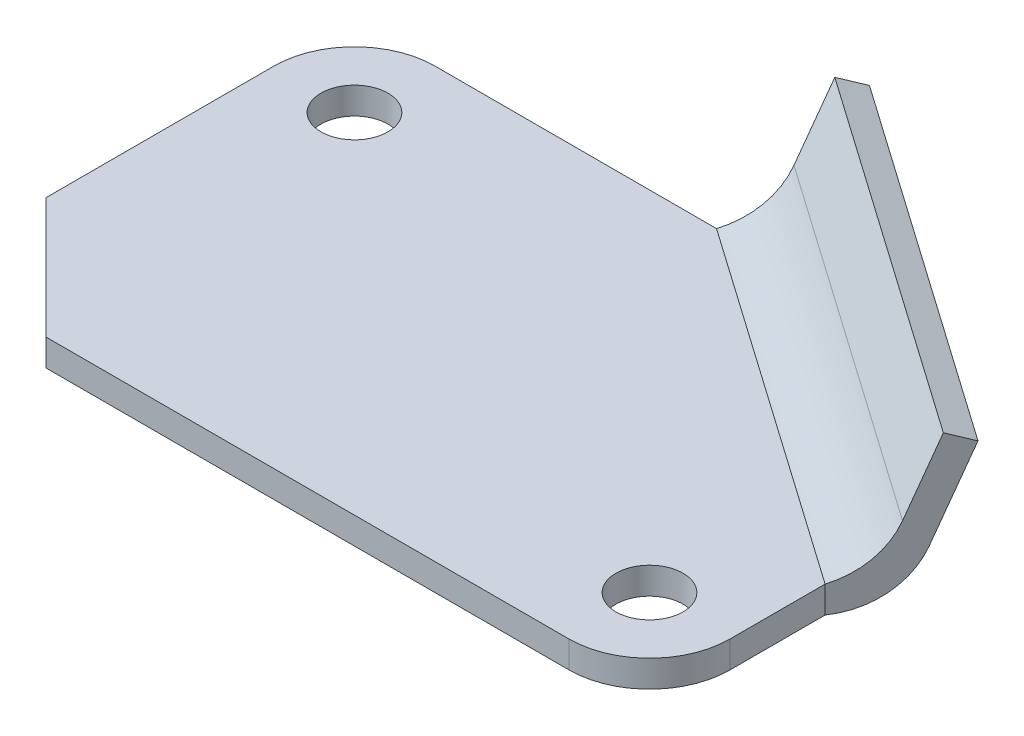
ISO-10303-21;
HEADER;
FILE_DESCRIPTION(('STEP AP214'),'2;1');
FILE_NAME('part.step','',(''),(''),'','','');
FILE_SCHEMA(('AUTOMOTIVE_DESIGN { 1 0 10303 214 1 1 1 1 }'));
ENDSEC;
DATA;
#1=APPLICATION_CONTEXT('core data for automotive mechanical design processes');
#2=APPLICATION_PROTOCOL_DEFINITION('international standard','automotive_design',2000,#1);
#3=PRODUCT_CONTEXT('',#1,'mechanical');
#4=PRODUCT('Part','Part','',(#3));
#5=PRODUCT_RELATED_PRODUCT_CATEGORY('part','',(#4));
#6=PRODUCT_DEFINITION_FORMATION('','',#4);
#7=PRODUCT_DEFINITION_CONTEXT('part definition',#1,'design');
#8=PRODUCT_DEFINITION('design','',#6,#7);
#9=PRODUCT_DEFINITION_SHAPE('','',#8);
#10=(LENGTH_UNIT() NAMED_UNIT(*) SI_UNIT(.MILLI.,.METRE.));
#11=(NAMED_UNIT(*) PLANE_ANGLE_UNIT() SI_UNIT($,.RADIAN.));
#12=(NAMED_UNIT(*) SI_UNIT($,.STERADIAN.) SOLID_ANGLE_UNIT());
#13=UNCERTAINTY_MEASURE_WITH_UNIT(LENGTH_MEASURE(1.E-05),#10,'distance_accuracy_value','');
#14=(GEOMETRIC_REPRESENTATION_CONTEXT(3) GLOBAL_UNCERTAINTY_ASSIGNED_CONTEXT((#13)) GLOBAL_UNIT_ASSIGNED_CONTEXT((#10,
#11,#12)) REPRESENTATION_CONTEXT('',''));
#15=CARTESIAN_POINT('',(0.,0.,0.));
#16=DIRECTION('',(0.,0.,1.));
#17=DIRECTION('',(1.,0.,0.));
#18=AXIS2_PLACEMENT_3D('',#15,#16,#17);
#19=CARTESIAN_POINT('',(-1.62626645259759,15.6602325308119,-29.6774508072912));
#20=DIRECTION('',(0.819152044288995,0.,0.573576436351041));
#21=DIRECTION('',(0.573576436351041,0.,-0.819152044288995));
#22=AXIS2_PLACEMENT_3D('',#19,#20,#21);
#23=CYLINDRICAL_SURFACE('',#22,12.);
#24=CARTESIAN_POINT('',(52.3737335474024,15.6602325308119,8.13375625603269));
#25=DIRECTION('',(-0.819152044288995,0.,-0.573576436351041));
#26=DIRECTION('',(0.573576436351041,0.,-0.819152044288995));
#27=AXIS2_PLACEMENT_3D('',#24,#25,#26);
#28=CIRCLE('',#27,12.);
#29=CARTESIAN_POINT('',(58.7554632811381,11.164953409821,-0.980298342768932));
#30=VERTEX_POINT('',#29);
#31=CARTESIAN_POINT('',(54.,4.,5.81120706332387));
#32=VERTEX_POINT('',#31);
#33=EDGE_CURVE('E134',#30,#32,#28,.T.);
#34=ORIENTED_EDGE('',*,*,#33,.F.);
#35=DIRECTION('',(0.819152044288995,0.,0.573576436351041));
#36=VECTOR('',#35,1.);
#37=CARTESIAN_POINT('',(4.7554632811381,11.164953409821,-38.7915054060928));
#38=LINE('',#37,#36);
#39=CARTESIAN_POINT('',(4.7554632811381,11.164953409821,-38.7915054060928));
#40=VERTEX_POINT('',#39);
#41=EDGE_CURVE('E12',#40,#30,#38,.T.);
#42=ORIENTED_EDGE('',*,*,#41,.F.);
#43=CARTESIAN_POINT('',(-1.62626645259759,15.6602325308119,-29.6774508072912));
#44=DIRECTION('',(-0.819152044288995,0.,-0.573576436351041));
#45=DIRECTION('',(0.573576436351041,0.,-0.819152044288995));
#46=AXIS2_PLACEMENT_3D('',#43,#44,#45);
#47=CIRCLE('',#46,12.);
#48=CARTESIAN_POINT('',(0.,4.,-32.));
#49=VERTEX_POINT('',#48);
#50=EDGE_CURVE('E148',#40,#49,#47,.T.);
#51=ORIENTED_EDGE('',*,*,#50,.T.);
#52=DIRECTION('',(0.819152044288995,0.,0.573576436351041));
#53=VECTOR('',#52,1.);
#54=CARTESIAN_POINT('',(0.,4.,-32.));
#55=LINE('',#54,#53);
#56=EDGE_CURVE('E52',#49,#32,#55,.T.);
#57=ORIENTED_EDGE('',*,*,#56,.T.);
#58=EDGE_LOOP('',(#34,#42,#51,#57));
#59=FACE_BOUND('',#58,.T.);
#60=ADVANCED_FACE('F49',(#59),#23,.F.);
#61=CARTESIAN_POINT('',(4.7554632811381,11.164953409821,-38.7915054060928));
#62=DIRECTION('',(-0.531810811144641,0.374606593415909,0.759504549900135));
#63=DIRECTION('',(0.819152044288995,0.,0.573576436351041));
#64=AXIS2_PLACEMENT_3D('',#61,#62,#63);
#65=PLANE('',#64);
#66=DIRECTION('',(-0.214865514885101,-0.927183854566788,0.306859756800778));
#67=VECTOR('',#66,1.);
#68=CARTESIAN_POINT('',(58.7554632811381,11.164953409821,-0.980298342768932));
#69=LINE('',#68,#67);
#70=CARTESIAN_POINT('',(61.2626036975485,21.9837212166078,-4.56086593108812));
#71=VERTEX_POINT('',#70);
#72=EDGE_CURVE('E146',#71,#30,#69,.T.);
#73=ORIENTED_EDGE('',*,*,#72,.F.);
#74=DIRECTION('',(0.819152044288995,0.,0.573576436351041));
#75=VECTOR('',#74,1.);
#76=CARTESIAN_POINT('',(7.26260369754853,21.9837212166078,-42.372072994412));
#77=LINE('',#76,#75);
#78=CARTESIAN_POINT('',(7.26260369754853,21.9837212166078,-42.372072994412));
#79=VERTEX_POINT('',#78);
#80=EDGE_CURVE('E58',#79,#71,#77,.T.);
#81=ORIENTED_EDGE('',*,*,#80,.F.);
#82=DIRECTION('',(-0.214865514885101,-0.927183854566788,0.306859756800778));
#83=VECTOR('',#82,1.);
#84=CARTESIAN_POINT('',(4.7554632811381,11.164953409821,-38.7915054060928));
#85=LINE('',#84,#83);
#86=EDGE_CURVE('E124',#79,#40,#85,.T.);
#87=ORIENTED_EDGE('',*,*,#86,.T.);
#88=ORIENTED_EDGE('',*,*,#41,.T.);
#89=EDGE_LOOP('',(#73,#81,#87,#88));
#90=FACE_BOUND('',#89,.T.);
#91=ADVANCED_FACE('F156',(#90),#65,.T.);
#92=CARTESIAN_POINT('',(7.26260369754853,21.9837212166078,-42.372072994412));
#93=DIRECTION('',(0.214865514885101,0.927183854566788,-0.306859756800779));
#94=DIRECTION('',(0.,0.314198283252714,0.949357382022728));
#95=AXIS2_PLACEMENT_3D('',#92,#93,#94);
#96=PLANE('',#95);
#97=DIRECTION('',(-0.531810811144642,0.37460659341591,0.759504549900134));
#98=VECTOR('',#97,1.);
#99=CARTESIAN_POINT('',(61.2626036975485,21.9837212166078,-4.56086593108812));
#100=LINE('',#99,#98);
#101=CARTESIAN_POINT('',(63.3898469421271,20.4852948429441,-7.59888413068865));
#102=VERTEX_POINT('',#101);
#103=EDGE_CURVE('E111',#102,#71,#100,.T.);
#104=ORIENTED_EDGE('',*,*,#103,.F.);
#105=DIRECTION('',(0.819152044288995,0.,0.573576436351041));
#106=VECTOR('',#105,1.);
#107=CARTESIAN_POINT('',(9.38984694212709,20.4852948429441,-45.4100911940125));
#108=LINE('',#107,#106);
#109=CARTESIAN_POINT('',(9.38984694212709,20.4852948429441,-45.4100911940125));
#110=VERTEX_POINT('',#109);
#111=EDGE_CURVE('E106',#110,#102,#108,.T.);
#112=ORIENTED_EDGE('',*,*,#111,.F.);
#113=DIRECTION('',(-0.531810811144642,0.37460659341591,0.759504549900134));
#114=VECTOR('',#113,1.);
#115=CARTESIAN_POINT('',(7.26260369754853,21.9837212166078,-42.372072994412));
#116=LINE('',#115,#114);
#117=EDGE_CURVE('E109',#110,#79,#116,.T.);
#118=ORIENTED_EDGE('',*,*,#117,.T.);
#119=ORIENTED_EDGE('',*,*,#80,.T.);
#120=EDGE_LOOP('',(#104,#112,#118,#119));
#121=FACE_BOUND('',#120,.T.);
#122=ADVANCED_FACE('F108',(#121),#96,.T.);
#123=CARTESIAN_POINT('',(9.38984694212709,20.4852948429441,-45.4100911940125));
#124=DIRECTION('',(0.531810811144641,-0.374606593415909,-0.759504549900135));
#125=DIRECTION('',(-0.819152044288995,0.,-0.573576436351041));
#126=AXIS2_PLACEMENT_3D('',#123,#124,#125);
#127=PLANE('',#126);
#128=DIRECTION('',(0.214865514885101,0.927183854566789,-0.306859756800778));
#129=VECTOR('',#128,1.);
#130=CARTESIAN_POINT('',(63.3898469421271,20.4852948429441,-7.59888413068865));
#131=LINE('',#130,#129);
#132=CARTESIAN_POINT('',(60.3817297337357,7.50472087900909,-3.30284753547775));
#133=VERTEX_POINT('',#132);
#134=EDGE_CURVE('E143',#133,#102,#131,.T.);
#135=ORIENTED_EDGE('',*,*,#134,.F.);
#136=DIRECTION('',(0.819152044288995,0.,0.573576436351041));
#137=VECTOR('',#136,1.);
#138=CARTESIAN_POINT('',(6.38172973373567,7.50472087900909,-41.1140545988016));
#139=LINE('',#138,#137);
#140=CARTESIAN_POINT('',(6.38172973373567,7.50472087900909,-41.1140545988016));
#141=VERTEX_POINT('',#140);
#142=EDGE_CURVE('E116',#141,#133,#139,.T.);
#143=ORIENTED_EDGE('',*,*,#142,.F.);
#144=DIRECTION('',(0.214865514885101,0.927183854566789,-0.306859756800778));
#145=VECTOR('',#144,1.);
#146=CARTESIAN_POINT('',(9.38984694212709,20.4852948429441,-45.4100911940125));
#147=LINE('',#146,#145);
#148=EDGE_CURVE('E122',#141,#110,#147,.T.);
#149=ORIENTED_EDGE('',*,*,#148,.T.);
#150=ORIENTED_EDGE('',*,*,#111,.T.);
#151=EDGE_LOOP('',(#135,#143,#149,#150));
#152=FACE_BOUND('',#151,.T.);
#153=ADVANCED_FACE('F126',(#152),#127,.T.);
#154=CARTESIAN_POINT('',(0.,12.,-32.));
#155=DIRECTION('',(0.819152044288995,0.,0.573576436351041));
#156=DIRECTION('',(0.573576436351041,0.,-0.819152044288995));
#157=AXIS2_PLACEMENT_3D('',#154,#155,#156);
#158=CYLINDRICAL_SURFACE('',#157,12.);
#159=CARTESIAN_POINT('',(54.,12.,5.81120706332387));
#160=DIRECTION('',(0.819152044288995,0.,0.573576436351041));
#161=DIRECTION('',(-0.573576436351041,0.,0.819152044288995));
#162=AXIS2_PLACEMENT_3D('',#159,#160,#161);
#163=CIRCLE('',#162,12.);
#164=CARTESIAN_POINT('',(54.,0.,5.81120706332387));
#165=VERTEX_POINT('',#164);
#166=EDGE_CURVE('E140',#165,#133,#163,.T.);
#167=ORIENTED_EDGE('',*,*,#166,.F.);
#168=DIRECTION('',(0.819152044288995,0.,0.573576436351041));
#169=VECTOR('',#168,1.);
#170=CARTESIAN_POINT('',(0.,0.,-32.));
#171=LINE('',#170,#169);
#172=CARTESIAN_POINT('',(0.,0.,-32.));
#173=VERTEX_POINT('',#172);
#174=EDGE_CURVE('E151',#173,#165,#171,.T.);
#175=ORIENTED_EDGE('',*,*,#174,.F.);
#176=CARTESIAN_POINT('',(0.,12.,-32.));
#177=DIRECTION('',(0.819152044288995,0.,0.573576436351041));
#178=DIRECTION('',(-0.573576436351041,0.,0.819152044288995));
#179=AXIS2_PLACEMENT_3D('',#176,#177,#178);
#180=CIRCLE('',#179,12.);
#181=EDGE_CURVE('E127',#173,#141,#180,.T.);
#182=ORIENTED_EDGE('',*,*,#181,.T.);
#183=ORIENTED_EDGE('',*,*,#142,.T.);
#184=EDGE_LOOP('',(#167,#175,#182,#183));
#185=FACE_BOUND('',#184,.T.);
#186=ADVANCED_FACE('F169',(#185),#158,.T.);
#187=CARTESIAN_POINT('',(0.,4.,-32.));
#188=DIRECTION('',(-0.573576436351041,0.,0.819152044288995));
#189=DIRECTION('',(0.819152044288995,0.,0.573576436351041));
#190=AXIS2_PLACEMENT_3D('',#187,#188,#189);
#191=PLANE('',#190);
#192=DIRECTION('',(0.,-1.,0.));
#193=VECTOR('',#192,1.);
#194=CARTESIAN_POINT('',(54.,4.,5.81120706332387));
#195=LINE('',#194,#193);
#196=EDGE_CURVE('E137',#32,#165,#195,.T.);
#197=ORIENTED_EDGE('',*,*,#196,.F.);
#198=ORIENTED_EDGE('',*,*,#56,.F.);
#199=DIRECTION('',(0.,-1.,0.));
#200=VECTOR('',#199,1.);
#201=CARTESIAN_POINT('',(0.,4.,-32.));
#202=LINE('',#201,#200);
#203=EDGE_CURVE('E129',#49,#173,#202,.T.);
#204=ORIENTED_EDGE('',*,*,#203,.T.);
#205=ORIENTED_EDGE('',*,*,#174,.T.);
#206=EDGE_LOOP('',(#197,#198,#204,#205));
#207=FACE_BOUND('',#206,.T.);
#208=ADVANCED_FACE('F153',(#207),#191,.T.);
#209=CARTESIAN_POINT('',(-1.62626645259759,15.6602325308119,-29.6774508072912));
#210=DIRECTION('',(0.819152044288995,0.,0.573576436351041));
#211=DIRECTION('',(0.573576436351041,0.,-0.819152044288995));
#212=AXIS2_PLACEMENT_3D('',#209,#210,#211);
#213=PLANE('',#212);
#214=ORIENTED_EDGE('',*,*,#50,.F.);
#215=ORIENTED_EDGE('',*,*,#86,.F.);
#216=ORIENTED_EDGE('',*,*,#117,.F.);
#217=ORIENTED_EDGE('',*,*,#148,.F.);
#218=ORIENTED_EDGE('',*,*,#181,.F.);
#219=ORIENTED_EDGE('',*,*,#203,.F.);
#220=EDGE_LOOP('',(#214,#215,#216,#217,#218,#219));
#221=FACE_BOUND('',#220,.T.);
#222=ADVANCED_FACE('F120',(#221),#213,.F.);
#223=CARTESIAN_POINT('',(52.3737335474024,15.6602325308119,8.13375625603269));
#224=DIRECTION('',(0.819152044288995,0.,0.573576436351041));
#225=DIRECTION('',(0.573576436351041,0.,-0.819152044288995));
#226=AXIS2_PLACEMENT_3D('',#223,#224,#225);
#227=PLANE('',#226);
#228=ORIENTED_EDGE('',*,*,#33,.T.);
#229=ORIENTED_EDGE('',*,*,#196,.T.);
#230=ORIENTED_EDGE('',*,*,#166,.T.);
#231=ORIENTED_EDGE('',*,*,#134,.T.);
#232=ORIENTED_EDGE('',*,*,#103,.T.);
#233=ORIENTED_EDGE('',*,*,#72,.T.);
#234=EDGE_LOOP('',(#228,#229,#230,#231,#232,#233));
#235=FACE_BOUND('',#234,.T.);
#236=ADVANCED_FACE('F155',(#235),#227,.T.);
#237=CLOSED_SHELL('',(#60,#91,#122,#153,#186,#208,#222,#236));
#238=MANIFOLD_SOLID_BREP('B2',#237);
#239=CARTESIAN_POINT('',(42.,4.,20.));
#240=DIRECTION('',(0.,1.,0.));
#241=DIRECTION('',(0.,0.,1.));
#242=AXIS2_PLACEMENT_3D('',#239,#240,#241);
#243=PLANE('',#242);
#244=CARTESIAN_POINT('',(-42.,4.,-20.));
#245=DIRECTION('',(0.,1.,0.));
#246=DIRECTION('',(0.,0.,1.));
#247=AXIS2_PLACEMENT_3D('',#244,#245,#246);
#248=CIRCLE('',#247,5.);
#249=CARTESIAN_POINT('',(-42.,4.,-15.));
#250=VERTEX_POINT('',#249);
#251=EDGE_CURVE('E326',#250,#250,#248,.T.);
#252=ORIENTED_EDGE('',*,*,#251,.F.);
#253=EDGE_LOOP('',(#252));
#254=FACE_BOUND('',#253,.T.);
#255=DIRECTION('',(0.707106781186547,0.,0.707106781186548));
#256=VECTOR('',#255,1.);
#257=CARTESIAN_POINT('',(-54.,4.,14.));
#258=LINE('',#257,#256);
#259=CARTESIAN_POINT('',(-54.,4.,14.));
#260=VERTEX_POINT('',#259);
#261=CARTESIAN_POINT('',(-36.,4.,32.));
#262=VERTEX_POINT('',#261);
#263=EDGE_CURVE('E337',#260,#262,#258,.T.);
#264=ORIENTED_EDGE('',*,*,#263,.T.);
#265=DIRECTION('',(1.,0.,0.));
#266=VECTOR('',#265,1.);
#267=CARTESIAN_POINT('',(-36.,4.,32.));
#268=LINE('',#267,#266);
#269=CARTESIAN_POINT('',(42.,4.,32.));
#270=VERTEX_POINT('',#269);
#271=EDGE_CURVE('E285',#262,#270,#268,.T.);
#272=ORIENTED_EDGE('',*,*,#271,.T.);
#273=CARTESIAN_POINT('',(42.,4.,20.));
#274=DIRECTION('',(0.,1.,0.));
#275=DIRECTION('',(0.,0.,1.));
#276=AXIS2_PLACEMENT_3D('',#273,#274,#275);
#277=CIRCLE('',#276,12.);
#278=CARTESIAN_POINT('',(54.,4.,20.));
#279=VERTEX_POINT('',#278);
#280=EDGE_CURVE('E352',#270,#279,#277,.T.);
#281=ORIENTED_EDGE('',*,*,#280,.T.);
#282=DIRECTION('',(0.,0.,-1.));
#283=VECTOR('',#282,1.);
#284=CARTESIAN_POINT('',(54.,4.,20.));
#285=LINE('',#284,#283);
#286=CARTESIAN_POINT('',(54.,4.,5.81120706332386));
#287=VERTEX_POINT('',#286);
#288=EDGE_CURVE('E365',#279,#287,#285,.T.);
#289=ORIENTED_EDGE('',*,*,#288,.T.);
#290=DIRECTION('',(-0.819152044288995,0.,-0.573576436351041));
#291=VECTOR('',#290,1.);
#292=CARTESIAN_POINT('',(54.,4.,5.81120706332386));
#293=LINE('',#292,#291);
#294=CARTESIAN_POINT('',(0.,4.,-32.));
#295=VERTEX_POINT('',#294);
#296=EDGE_CURVE('E304',#287,#295,#293,.T.);
#297=ORIENTED_EDGE('',*,*,#296,.T.);
#298=DIRECTION('',(-1.,0.,0.));
#299=VECTOR('',#298,1.);
#300=CARTESIAN_POINT('',(0.,4.,-32.));
#301=LINE('',#300,#299);
#302=CARTESIAN_POINT('',(-42.,4.,-32.));
#303=VERTEX_POINT('',#302);
#304=EDGE_CURVE('E298',#295,#303,#301,.T.);
#305=ORIENTED_EDGE('',*,*,#304,.T.);
#306=CARTESIAN_POINT('',(-42.,4.,-20.));
#307=DIRECTION('',(0.,1.,0.));
#308=DIRECTION('',(0.,0.,1.));
#309=AXIS2_PLACEMENT_3D('',#306,#307,#308);
#310=CIRCLE('',#309,12.);
#311=CARTESIAN_POINT('',(-54.,4.,-19.9999999999999));
#312=VERTEX_POINT('',#311);
#313=EDGE_CURVE('E302',#303,#312,#310,.T.);
#314=ORIENTED_EDGE('',*,*,#313,.T.);
#315=DIRECTION('',(0.,0.,1.));
#316=VECTOR('',#315,1.);
#317=CARTESIAN_POINT('',(-54.,4.,-19.9999999999999));
#318=LINE('',#317,#316);
#319=EDGE_CURVE('E242',#312,#260,#318,.T.);
#320=ORIENTED_EDGE('',*,*,#319,.T.);
#321=EDGE_LOOP('',(#264,#272,#281,#289,#297,#305,#314,#320));
#322=FACE_BOUND('',#321,.T.);
#323=CARTESIAN_POINT('',(42.,4.,20.));
#324=DIRECTION('',(0.,1.,0.));
#325=DIRECTION('',(0.,0.,1.));
#326=AXIS2_PLACEMENT_3D('',#323,#324,#325);
#327=CIRCLE('',#326,5.);
#328=CARTESIAN_POINT('',(42.,4.,25.));
#329=VERTEX_POINT('',#328);
#330=EDGE_CURVE('E374',#329,#329,#327,.T.);
#331=ORIENTED_EDGE('',*,*,#330,.F.);
#332=EDGE_LOOP('',(#331));
#333=FACE_BOUND('',#332,.T.);
#334=ADVANCED_FACE('F225',(#254,#322,#333),#243,.T.);
#335=CARTESIAN_POINT('',(42.,0.,20.));
#336=DIRECTION('',(0.,1.,0.));
#337=DIRECTION('',(0.,0.,1.));
#338=AXIS2_PLACEMENT_3D('',#335,#336,#337);
#339=PLANE('',#338);
#340=DIRECTION('',(0.707106781186547,0.,0.707106781186548));
#341=VECTOR('',#340,1.);
#342=CARTESIAN_POINT('',(-54.,0.,14.));
#343=LINE('',#342,#341);
#344=CARTESIAN_POINT('',(-54.,0.,14.));
#345=VERTEX_POINT('',#344);
#346=CARTESIAN_POINT('',(-36.,0.,32.));
#347=VERTEX_POINT('',#346);
#348=EDGE_CURVE('E322',#345,#347,#343,.T.);
#349=ORIENTED_EDGE('',*,*,#348,.F.);
#350=DIRECTION('',(0.,0.,1.));
#351=VECTOR('',#350,1.);
#352=CARTESIAN_POINT('',(-54.,0.,-19.9999999999999));
#353=LINE('',#352,#351);
#354=CARTESIAN_POINT('',(-54.,0.,-19.9999999999999));
#355=VERTEX_POINT('',#354);
#356=EDGE_CURVE('E277',#355,#345,#353,.T.);
#357=ORIENTED_EDGE('',*,*,#356,.F.);
#358=CARTESIAN_POINT('',(-42.,0.,-20.));
#359=DIRECTION('',(0.,1.,0.));
#360=DIRECTION('',(0.,0.,1.));
#361=AXIS2_PLACEMENT_3D('',#358,#359,#360);
#362=CIRCLE('',#361,12.);
#363=CARTESIAN_POINT('',(-42.,0.,-32.));
#364=VERTEX_POINT('',#363);
#365=EDGE_CURVE('E271',#364,#355,#362,.T.);
#366=ORIENTED_EDGE('',*,*,#365,.F.);
#367=DIRECTION('',(-1.,0.,0.));
#368=VECTOR('',#367,1.);
#369=CARTESIAN_POINT('',(0.,0.,-32.));
#370=LINE('',#369,#368);
#371=CARTESIAN_POINT('',(0.,0.,-32.));
#372=VERTEX_POINT('',#371);
#373=EDGE_CURVE('E312',#372,#364,#370,.T.);
#374=ORIENTED_EDGE('',*,*,#373,.F.);
#375=DIRECTION('',(-0.819152044288995,0.,-0.573576436351041));
#376=VECTOR('',#375,1.);
#377=CARTESIAN_POINT('',(54.,0.,5.81120706332386));
#378=LINE('',#377,#376);
#379=CARTESIAN_POINT('',(54.,0.,5.81120706332386));
#380=VERTEX_POINT('',#379);
#381=EDGE_CURVE('E332',#380,#372,#378,.T.);
#382=ORIENTED_EDGE('',*,*,#381,.F.);
#383=DIRECTION('',(0.,0.,-1.));
#384=VECTOR('',#383,1.);
#385=CARTESIAN_POINT('',(54.,0.,20.));
#386=LINE('',#385,#384);
#387=CARTESIAN_POINT('',(54.,0.,20.));
#388=VERTEX_POINT('',#387);
#389=EDGE_CURVE('E330',#388,#380,#386,.T.);
#390=ORIENTED_EDGE('',*,*,#389,.F.);
#391=CARTESIAN_POINT('',(42.,0.,20.));
#392=DIRECTION('',(0.,1.,0.));
#393=DIRECTION('',(0.,0.,1.));
#394=AXIS2_PLACEMENT_3D('',#391,#392,#393);
#395=CIRCLE('',#394,12.);
#396=CARTESIAN_POINT('',(42.,0.,32.));
#397=VERTEX_POINT('',#396);
#398=EDGE_CURVE('E328',#397,#388,#395,.T.);
#399=ORIENTED_EDGE('',*,*,#398,.F.);
#400=DIRECTION('',(1.,0.,0.));
#401=VECTOR('',#400,1.);
#402=CARTESIAN_POINT('',(-36.,0.,32.));
#403=LINE('',#402,#401);
#404=EDGE_CURVE('E325',#347,#397,#403,.T.);
#405=ORIENTED_EDGE('',*,*,#404,.F.);
#406=EDGE_LOOP('',(#349,#357,#366,#374,#382,#390,#399,#405));
#407=FACE_BOUND('',#406,.T.);
#408=CARTESIAN_POINT('',(-42.,0.,-20.));
#409=DIRECTION('',(0.,1.,0.));
#410=DIRECTION('',(0.,0.,1.));
#411=AXIS2_PLACEMENT_3D('',#408,#409,#410);
#412=CIRCLE('',#411,5.);
#413=CARTESIAN_POINT('',(-42.,0.,-15.));
#414=VERTEX_POINT('',#413);
#415=EDGE_CURVE('E371',#414,#414,#412,.T.);
#416=ORIENTED_EDGE('',*,*,#415,.T.);
#417=EDGE_LOOP('',(#416));
#418=FACE_BOUND('',#417,.T.);
#419=CARTESIAN_POINT('',(42.,0.,20.));
#420=DIRECTION('',(0.,1.,0.));
#421=DIRECTION('',(0.,0.,1.));
#422=AXIS2_PLACEMENT_3D('',#419,#420,#421);
#423=CIRCLE('',#422,5.);
#424=CARTESIAN_POINT('',(42.,0.,25.));
#425=VERTEX_POINT('',#424);
#426=EDGE_CURVE('E377',#425,#425,#423,.T.);
#427=ORIENTED_EDGE('',*,*,#426,.T.);
#428=EDGE_LOOP('',(#427));
#429=FACE_BOUND('',#428,.T.);
#430=ADVANCED_FACE('F356',(#407,#418,#429),#339,.F.);
#431=CARTESIAN_POINT('',(-54.,4.,14.));
#432=DIRECTION('',(0.707106781186548,0.,-0.707106781186547));
#433=DIRECTION('',(-0.707106781186547,0.,-0.707106781186548));
#434=AXIS2_PLACEMENT_3D('',#431,#432,#433);
#435=PLANE('',#434);
#436=ORIENTED_EDGE('',*,*,#348,.T.);
#437=DIRECTION('',(0.,-1.,0.));
#438=VECTOR('',#437,1.);
#439=CARTESIAN_POINT('',(-36.,4.,32.));
#440=LINE('',#439,#438);
#441=EDGE_CURVE('E47',#262,#347,#440,.T.);
#442=ORIENTED_EDGE('',*,*,#441,.F.);
#443=ORIENTED_EDGE('',*,*,#263,.F.);
#444=DIRECTION('',(0.,-1.,0.));
#445=VECTOR('',#444,1.);
#446=CARTESIAN_POINT('',(-54.,4.,14.));
#447=LINE('',#446,#445);
#448=EDGE_CURVE('E318',#260,#345,#447,.T.);
#449=ORIENTED_EDGE('',*,*,#448,.T.);
#450=EDGE_LOOP('',(#436,#442,#443,#449));
#451=FACE_BOUND('',#450,.T.);
#452=ADVANCED_FACE('F227',(#451),#435,.F.);
#453=CARTESIAN_POINT('',(-36.,4.,32.));
#454=DIRECTION('',(0.,0.,-1.));
#455=DIRECTION('',(-1.,0.,0.));
#456=AXIS2_PLACEMENT_3D('',#453,#454,#455);
#457=PLANE('',#456);
#458=ORIENTED_EDGE('',*,*,#404,.T.);
#459=DIRECTION('',(0.,-1.,0.));
#460=VECTOR('',#459,1.);
#461=CARTESIAN_POINT('',(42.,4.,32.));
#462=LINE('',#461,#460);
#463=EDGE_CURVE('E234',#270,#397,#462,.T.);
#464=ORIENTED_EDGE('',*,*,#463,.F.);
#465=ORIENTED_EDGE('',*,*,#271,.F.);
#466=ORIENTED_EDGE('',*,*,#441,.T.);
#467=EDGE_LOOP('',(#458,#464,#465,#466));
#468=FACE_BOUND('',#467,.T.);
#469=ADVANCED_FACE('F409',(#468),#457,.F.);
#470=CARTESIAN_POINT('',(42.,4.,20.));
#471=DIRECTION('',(0.,-1.,0.));
#472=DIRECTION('',(0.,0.,-1.));
#473=AXIS2_PLACEMENT_3D('',#470,#471,#472);
#474=CYLINDRICAL_SURFACE('',#473,12.);
#475=ORIENTED_EDGE('',*,*,#398,.T.);
#476=DIRECTION('',(0.,-1.,0.));
#477=VECTOR('',#476,1.);
#478=CARTESIAN_POINT('',(54.,4.,20.));
#479=LINE('',#478,#477);
#480=EDGE_CURVE('E344',#279,#388,#479,.T.);
#481=ORIENTED_EDGE('',*,*,#480,.F.);
#482=ORIENTED_EDGE('',*,*,#280,.F.);
#483=ORIENTED_EDGE('',*,*,#463,.T.);
#484=EDGE_LOOP('',(#475,#481,#482,#483));
#485=FACE_BOUND('',#484,.T.);
#486=ADVANCED_FACE('F350',(#485),#474,.T.);
#487=CARTESIAN_POINT('',(54.,4.,20.));
#488=DIRECTION('',(-1.,0.,0.));
#489=DIRECTION('',(0.,0.,1.));
#490=AXIS2_PLACEMENT_3D('',#487,#488,#489);
#491=PLANE('',#490);
#492=ORIENTED_EDGE('',*,*,#389,.T.);
#493=DIRECTION('',(0.,-1.,0.));
#494=VECTOR('',#493,1.);
#495=CARTESIAN_POINT('',(54.,4.,5.81120706332386));
#496=LINE('',#495,#494);
#497=EDGE_CURVE('E341',#287,#380,#496,.T.);
#498=ORIENTED_EDGE('',*,*,#497,.F.);
#499=ORIENTED_EDGE('',*,*,#288,.F.);
#500=ORIENTED_EDGE('',*,*,#480,.T.);
#501=EDGE_LOOP('',(#492,#498,#499,#500));
#502=FACE_BOUND('',#501,.T.);
#503=ADVANCED_FACE('F361',(#502),#491,.F.);
#504=CARTESIAN_POINT('',(54.,4.,5.81120706332386));
#505=DIRECTION('',(-0.573576436351041,0.,0.819152044288995));
#506=DIRECTION('',(0.819152044288995,0.,0.573576436351041));
#507=AXIS2_PLACEMENT_3D('',#504,#505,#506);
#508=PLANE('',#507);
#509=ORIENTED_EDGE('',*,*,#381,.T.);
#510=DIRECTION('',(0.,-1.,0.));
#511=VECTOR('',#510,1.);
#512=CARTESIAN_POINT('',(0.,4.,-32.));
#513=LINE('',#512,#511);
#514=EDGE_CURVE('E313',#295,#372,#513,.T.);
#515=ORIENTED_EDGE('',*,*,#514,.F.);
#516=ORIENTED_EDGE('',*,*,#296,.F.);
#517=ORIENTED_EDGE('',*,*,#497,.T.);
#518=EDGE_LOOP('',(#509,#515,#516,#517));
#519=FACE_BOUND('',#518,.T.);
#520=ADVANCED_FACE('F364',(#519),#508,.F.);
#521=CARTESIAN_POINT('',(0.,4.,-32.));
#522=DIRECTION('',(0.,0.,1.));
#523=DIRECTION('',(1.,0.,0.));
#524=AXIS2_PLACEMENT_3D('',#521,#522,#523);
#525=PLANE('',#524);
#526=ORIENTED_EDGE('',*,*,#373,.T.);
#527=DIRECTION('',(0.,-1.,0.));
#528=VECTOR('',#527,1.);
#529=CARTESIAN_POINT('',(-42.,4.,-32.));
#530=LINE('',#529,#528);
#531=EDGE_CURVE('E309',#303,#364,#530,.T.);
#532=ORIENTED_EDGE('',*,*,#531,.F.);
#533=ORIENTED_EDGE('',*,*,#304,.F.);
#534=ORIENTED_EDGE('',*,*,#514,.T.);
#535=EDGE_LOOP('',(#526,#532,#533,#534));
#536=FACE_BOUND('',#535,.T.);
#537=ADVANCED_FACE('F310',(#536),#525,.F.);
#538=CARTESIAN_POINT('',(-42.,4.,-20.));
#539=DIRECTION('',(0.,-1.,0.));
#540=DIRECTION('',(0.,0.,-1.));
#541=AXIS2_PLACEMENT_3D('',#538,#539,#540);
#542=CYLINDRICAL_SURFACE('',#541,12.);
#543=ORIENTED_EDGE('',*,*,#365,.T.);
#544=DIRECTION('',(0.,-1.,0.));
#545=VECTOR('',#544,1.);
#546=CARTESIAN_POINT('',(-54.,4.,-19.9999999999999));
#547=LINE('',#546,#545);
#548=EDGE_CURVE('E314',#312,#355,#547,.T.);
#549=ORIENTED_EDGE('',*,*,#548,.F.);
#550=ORIENTED_EDGE('',*,*,#313,.F.);
#551=ORIENTED_EDGE('',*,*,#531,.T.);
#552=EDGE_LOOP('',(#543,#549,#550,#551));
#553=FACE_BOUND('',#552,.T.);
#554=ADVANCED_FACE('F316',(#553),#542,.T.);
#555=CARTESIAN_POINT('',(-54.,4.,-19.9999999999999));
#556=DIRECTION('',(1.,0.,0.));
#557=DIRECTION('',(0.,0.,-1.));
#558=AXIS2_PLACEMENT_3D('',#555,#556,#557);
#559=PLANE('',#558);
#560=ORIENTED_EDGE('',*,*,#356,.T.);
#561=ORIENTED_EDGE('',*,*,#448,.F.);
#562=ORIENTED_EDGE('',*,*,#319,.F.);
#563=ORIENTED_EDGE('',*,*,#548,.T.);
#564=EDGE_LOOP('',(#560,#561,#562,#563));
#565=FACE_BOUND('',#564,.T.);
#566=ADVANCED_FACE('F397',(#565),#559,.F.);
#567=CARTESIAN_POINT('',(-42.,4.,-20.));
#568=DIRECTION('',(0.,-1.,0.));
#569=DIRECTION('',(0.,0.,-1.));
#570=AXIS2_PLACEMENT_3D('',#567,#568,#569);
#571=CYLINDRICAL_SURFACE('',#570,5.);
#572=ORIENTED_EDGE('',*,*,#251,.T.);
#573=EDGE_LOOP('',(#572));
#574=FACE_BOUND('',#573,.T.);
#575=ORIENTED_EDGE('',*,*,#415,.F.);
#576=EDGE_LOOP('',(#575));
#577=FACE_BOUND('',#576,.T.);
#578=ADVANCED_FACE('F394',(#574,#577),#571,.F.);
#579=CARTESIAN_POINT('',(42.,4.,20.));
#580=DIRECTION('',(0.,-1.,0.));
#581=DIRECTION('',(0.,0.,-1.));
#582=AXIS2_PLACEMENT_3D('',#579,#580,#581);
#583=CYLINDRICAL_SURFACE('',#582,5.);
#584=ORIENTED_EDGE('',*,*,#330,.T.);
#585=EDGE_LOOP('',(#584));
#586=FACE_BOUND('',#585,.T.);
#587=ORIENTED_EDGE('',*,*,#426,.F.);
#588=EDGE_LOOP('',(#587));
#589=FACE_BOUND('',#588,.T.);
#590=ADVANCED_FACE('F383',(#586,#589),#583,.F.);
#591=CLOSED_SHELL('',(#334,#430,#452,#469,#486,#503,#520,#537,#554,#566,#578,#590));
#592=MANIFOLD_SOLID_BREP('B6',#591);
#593=ADVANCED_BREP_SHAPE_REPRESENTATION('',(#18,#238,#592),#14);
#594=SHAPE_DEFINITION_REPRESENTATION(#9,#593);
ENDSEC;
END-ISO-10303-21;
